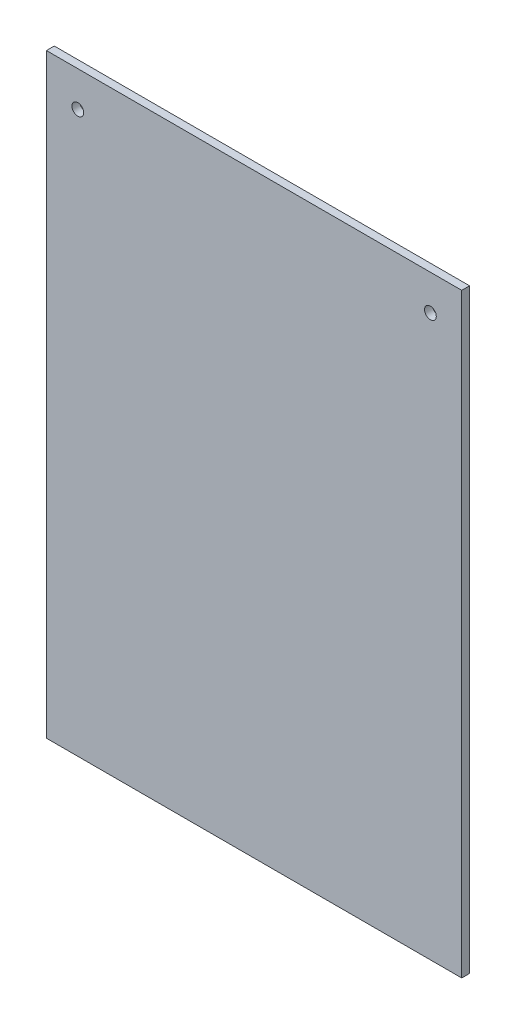
ISO-10303-21;
HEADER;
FILE_DESCRIPTION(('STEP AP214'),'2;1');
FILE_NAME('part.step','',(''),(''),'','','');
FILE_SCHEMA(('AUTOMOTIVE_DESIGN { 1 0 10303 214 1 1 1 1 }'));
ENDSEC;
DATA;
#1=APPLICATION_CONTEXT('core data for automotive mechanical design processes');
#2=APPLICATION_PROTOCOL_DEFINITION('international standard','automotive_design',2000,#1);
#3=PRODUCT_CONTEXT('',#1,'mechanical');
#4=PRODUCT('Part','Part','',(#3));
#5=PRODUCT_RELATED_PRODUCT_CATEGORY('part','',(#4));
#6=PRODUCT_DEFINITION_FORMATION('','',#4);
#7=PRODUCT_DEFINITION_CONTEXT('part definition',#1,'design');
#8=PRODUCT_DEFINITION('design','',#6,#7);
#9=PRODUCT_DEFINITION_SHAPE('','',#8);
#10=(LENGTH_UNIT() NAMED_UNIT(*) SI_UNIT(.MILLI.,.METRE.));
#11=(NAMED_UNIT(*) PLANE_ANGLE_UNIT() SI_UNIT($,.RADIAN.));
#12=(NAMED_UNIT(*) SI_UNIT($,.STERADIAN.) SOLID_ANGLE_UNIT());
#13=UNCERTAINTY_MEASURE_WITH_UNIT(LENGTH_MEASURE(1.E-05),#10,'distance_accuracy_value','');
#14=(GEOMETRIC_REPRESENTATION_CONTEXT(3) GLOBAL_UNCERTAINTY_ASSIGNED_CONTEXT((#13)) GLOBAL_UNIT_ASSIGNED_CONTEXT((#10,
#11,#12)) REPRESENTATION_CONTEXT('',''));
#15=CARTESIAN_POINT('',(0.,0.,0.));
#16=DIRECTION('',(0.,0.,1.));
#17=DIRECTION('',(1.,0.,0.));
#18=AXIS2_PLACEMENT_3D('',#15,#16,#17);
#19=CARTESIAN_POINT('',(0.,0.,0.));
#20=DIRECTION('',(0.,0.,1.));
#21=DIRECTION('',(1.,0.,0.));
#22=AXIS2_PLACEMENT_3D('',#19,#20,#21);
#23=PLANE('',#22);
#24=CARTESIAN_POINT('',(311.15,454.025,0.));
#25=DIRECTION('',(0.,0.,1.));
#26=DIRECTION('',(1.,0.,0.));
#27=AXIS2_PLACEMENT_3D('',#24,#25,#26);
#28=CIRCLE('',#27,4.7625);
#29=CARTESIAN_POINT('',(315.9125,454.025,0.));
#30=VERTEX_POINT('',#29);
#31=EDGE_CURVE('E82',#30,#30,#28,.T.);
#32=ORIENTED_EDGE('',*,*,#31,.T.);
#33=EDGE_LOOP('',(#32));
#34=FACE_BOUND('',#33,.T.);
#35=CARTESIAN_POINT('',(25.4,454.025,0.));
#36=DIRECTION('',(0.,0.,1.));
#37=DIRECTION('',(1.,0.,0.));
#38=AXIS2_PLACEMENT_3D('',#35,#36,#37);
#39=CIRCLE('',#38,4.7625);
#40=CARTESIAN_POINT('',(30.1625,454.025,0.));
#41=VERTEX_POINT('',#40);
#42=EDGE_CURVE('E19',#41,#41,#39,.T.);
#43=ORIENTED_EDGE('',*,*,#42,.T.);
#44=EDGE_LOOP('',(#43));
#45=FACE_BOUND('',#44,.T.);
#46=DIRECTION('',(1.,0.,0.));
#47=VECTOR('',#46,1.);
#48=CARTESIAN_POINT('',(336.55,482.6,0.));
#49=LINE('',#48,#47);
#50=CARTESIAN_POINT('',(336.55,482.6,0.));
#51=VERTEX_POINT('',#50);
#52=CARTESIAN_POINT('',(0.,482.6,0.));
#53=VERTEX_POINT('',#52);
#54=EDGE_CURVE('E54',#51,#53,#49,.F.);
#55=ORIENTED_EDGE('',*,*,#54,.F.);
#56=DIRECTION('',(0.,1.,0.));
#57=VECTOR('',#56,1.);
#58=CARTESIAN_POINT('',(336.55,0.,0.));
#59=LINE('',#58,#57);
#60=CARTESIAN_POINT('',(336.55,0.,0.));
#61=VERTEX_POINT('',#60);
#62=EDGE_CURVE('E59',#61,#51,#59,.T.);
#63=ORIENTED_EDGE('',*,*,#62,.F.);
#64=DIRECTION('',(1.,0.,0.));
#65=VECTOR('',#64,1.);
#66=CARTESIAN_POINT('',(0.,0.,0.));
#67=LINE('',#66,#65);
#68=CARTESIAN_POINT('',(0.,0.,0.));
#69=VERTEX_POINT('',#68);
#70=EDGE_CURVE('E89',#69,#61,#67,.T.);
#71=ORIENTED_EDGE('',*,*,#70,.F.);
#72=DIRECTION('',(0.,1.,0.));
#73=VECTOR('',#72,1.);
#74=CARTESIAN_POINT('',(0.,482.6,0.));
#75=LINE('',#74,#73);
#76=EDGE_CURVE('E69',#53,#69,#75,.F.);
#77=ORIENTED_EDGE('',*,*,#76,.F.);
#78=EDGE_LOOP('',(#55,#63,#71,#77));
#79=FACE_BOUND('',#78,.T.);
#80=ADVANCED_FACE('F16',(#34,#45,#79),#23,.F.);
#81=CARTESIAN_POINT('',(336.55,0.,0.));
#82=DIRECTION('',(1.,0.,0.));
#83=DIRECTION('',(0.,0.,-1.));
#84=AXIS2_PLACEMENT_3D('',#81,#82,#83);
#85=PLANE('',#84);
#86=DIRECTION('',(0.,0.,-1.));
#87=VECTOR('',#86,1.);
#88=CARTESIAN_POINT('',(336.55,0.,0.));
#89=LINE('',#88,#87);
#90=CARTESIAN_POINT('',(336.55,0.,6.35));
#91=VERTEX_POINT('',#90);
#92=EDGE_CURVE('E64',#61,#91,#89,.F.);
#93=ORIENTED_EDGE('',*,*,#92,.F.);
#94=ORIENTED_EDGE('',*,*,#62,.T.);
#95=DIRECTION('',(0.,0.,1.));
#96=VECTOR('',#95,1.);
#97=CARTESIAN_POINT('',(336.55,482.6,0.));
#98=LINE('',#97,#96);
#99=CARTESIAN_POINT('',(336.55,482.6,6.35));
#100=VERTEX_POINT('',#99);
#101=EDGE_CURVE('E61',#100,#51,#98,.F.);
#102=ORIENTED_EDGE('',*,*,#101,.F.);
#103=DIRECTION('',(0.,1.,0.));
#104=VECTOR('',#103,1.);
#105=CARTESIAN_POINT('',(336.55,0.,6.35));
#106=LINE('',#105,#104);
#107=EDGE_CURVE('E84',#91,#100,#106,.T.);
#108=ORIENTED_EDGE('',*,*,#107,.F.);
#109=EDGE_LOOP('',(#93,#94,#102,#108));
#110=FACE_BOUND('',#109,.T.);
#111=ADVANCED_FACE('F60',(#110),#85,.T.);
#112=CARTESIAN_POINT('',(336.55,482.6,0.));
#113=DIRECTION('',(0.,1.,0.));
#114=DIRECTION('',(0.,0.,1.));
#115=AXIS2_PLACEMENT_3D('',#112,#113,#114);
#116=PLANE('',#115);
#117=ORIENTED_EDGE('',*,*,#101,.T.);
#118=ORIENTED_EDGE('',*,*,#54,.T.);
#119=DIRECTION('',(0.,0.,1.));
#120=VECTOR('',#119,1.);
#121=CARTESIAN_POINT('',(0.,482.6,0.));
#122=LINE('',#121,#120);
#123=CARTESIAN_POINT('',(0.,482.6,6.35));
#124=VERTEX_POINT('',#123);
#125=EDGE_CURVE('E71',#124,#53,#122,.F.);
#126=ORIENTED_EDGE('',*,*,#125,.F.);
#127=DIRECTION('',(1.,0.,0.));
#128=VECTOR('',#127,1.);
#129=CARTESIAN_POINT('',(0.,482.6,6.35));
#130=LINE('',#129,#128);
#131=EDGE_CURVE('E75',#100,#124,#130,.F.);
#132=ORIENTED_EDGE('',*,*,#131,.F.);
#133=EDGE_LOOP('',(#117,#118,#126,#132));
#134=FACE_BOUND('',#133,.T.);
#135=ADVANCED_FACE('F73',(#134),#116,.T.);
#136=CARTESIAN_POINT('',(0.,482.6,0.));
#137=DIRECTION('',(-1.,0.,0.));
#138=DIRECTION('',(0.,0.,1.));
#139=AXIS2_PLACEMENT_3D('',#136,#137,#138);
#140=PLANE('',#139);
#141=ORIENTED_EDGE('',*,*,#125,.T.);
#142=ORIENTED_EDGE('',*,*,#76,.T.);
#143=DIRECTION('',(0.,0.,-1.));
#144=VECTOR('',#143,1.);
#145=CARTESIAN_POINT('',(0.,0.,0.));
#146=LINE('',#145,#144);
#147=CARTESIAN_POINT('',(0.,0.,6.35));
#148=VERTEX_POINT('',#147);
#149=EDGE_CURVE('E34',#148,#69,#146,.T.);
#150=ORIENTED_EDGE('',*,*,#149,.F.);
#151=DIRECTION('',(0.,1.,0.));
#152=VECTOR('',#151,1.);
#153=CARTESIAN_POINT('',(0.,0.,6.35));
#154=LINE('',#153,#152);
#155=EDGE_CURVE('E100',#124,#148,#154,.F.);
#156=ORIENTED_EDGE('',*,*,#155,.F.);
#157=EDGE_LOOP('',(#141,#142,#150,#156));
#158=FACE_BOUND('',#157,.T.);
#159=ADVANCED_FACE('F98',(#158),#140,.T.);
#160=CARTESIAN_POINT('',(0.,0.,0.));
#161=DIRECTION('',(0.,-1.,0.));
#162=DIRECTION('',(0.,0.,-1.));
#163=AXIS2_PLACEMENT_3D('',#160,#161,#162);
#164=PLANE('',#163);
#165=ORIENTED_EDGE('',*,*,#149,.T.);
#166=ORIENTED_EDGE('',*,*,#70,.T.);
#167=ORIENTED_EDGE('',*,*,#92,.T.);
#168=DIRECTION('',(1.,0.,0.));
#169=VECTOR('',#168,1.);
#170=CARTESIAN_POINT('',(0.,0.,6.35));
#171=LINE('',#170,#169);
#172=EDGE_CURVE('E81',#148,#91,#171,.T.);
#173=ORIENTED_EDGE('',*,*,#172,.F.);
#174=EDGE_LOOP('',(#165,#166,#167,#173));
#175=FACE_BOUND('',#174,.T.);
#176=ADVANCED_FACE('F106',(#175),#164,.T.);
#177=CARTESIAN_POINT('',(25.4,454.025,0.));
#178=DIRECTION('',(0.,0.,1.));
#179=DIRECTION('',(1.,0.,0.));
#180=AXIS2_PLACEMENT_3D('',#177,#178,#179);
#181=CYLINDRICAL_SURFACE('',#180,4.7625);
#182=CARTESIAN_POINT('',(25.4,454.025,6.35));
#183=DIRECTION('',(0.,0.,1.));
#184=DIRECTION('',(1.,0.,0.));
#185=AXIS2_PLACEMENT_3D('',#182,#183,#184);
#186=CIRCLE('',#185,4.7625);
#187=CARTESIAN_POINT('',(30.1625,454.025,6.35));
#188=VERTEX_POINT('',#187);
#189=EDGE_CURVE('E25',#188,#188,#186,.F.);
#190=ORIENTED_EDGE('',*,*,#189,.F.);
#191=EDGE_LOOP('',(#190));
#192=FACE_BOUND('',#191,.T.);
#193=ORIENTED_EDGE('',*,*,#42,.F.);
#194=EDGE_LOOP('',(#193));
#195=FACE_BOUND('',#194,.T.);
#196=ADVANCED_FACE('F108',(#192,#195),#181,.F.);
#197=CARTESIAN_POINT('',(311.15,454.025,0.));
#198=DIRECTION('',(0.,0.,1.));
#199=DIRECTION('',(1.,0.,0.));
#200=AXIS2_PLACEMENT_3D('',#197,#198,#199);
#201=CYLINDRICAL_SURFACE('',#200,4.7625);
#202=CARTESIAN_POINT('',(311.15,454.025,6.35));
#203=DIRECTION('',(0.,0.,1.));
#204=DIRECTION('',(1.,0.,0.));
#205=AXIS2_PLACEMENT_3D('',#202,#203,#204);
#206=CIRCLE('',#205,4.7625);
#207=CARTESIAN_POINT('',(315.9125,454.025,6.35));
#208=VERTEX_POINT('',#207);
#209=EDGE_CURVE('E11',#208,#208,#206,.F.);
#210=ORIENTED_EDGE('',*,*,#209,.F.);
#211=EDGE_LOOP('',(#210));
#212=FACE_BOUND('',#211,.T.);
#213=ORIENTED_EDGE('',*,*,#31,.F.);
#214=EDGE_LOOP('',(#213));
#215=FACE_BOUND('',#214,.T.);
#216=ADVANCED_FACE('F115',(#212,#215),#201,.F.);
#217=CARTESIAN_POINT('',(0.,0.,6.35));
#218=DIRECTION('',(0.,0.,1.));
#219=DIRECTION('',(1.,0.,0.));
#220=AXIS2_PLACEMENT_3D('',#217,#218,#219);
#221=PLANE('',#220);
#222=ORIENTED_EDGE('',*,*,#209,.T.);
#223=EDGE_LOOP('',(#222));
#224=FACE_BOUND('',#223,.T.);
#225=ORIENTED_EDGE('',*,*,#189,.T.);
#226=EDGE_LOOP('',(#225));
#227=FACE_BOUND('',#226,.T.);
#228=ORIENTED_EDGE('',*,*,#155,.T.);
#229=ORIENTED_EDGE('',*,*,#172,.T.);
#230=ORIENTED_EDGE('',*,*,#107,.T.);
#231=ORIENTED_EDGE('',*,*,#131,.T.);
#232=EDGE_LOOP('',(#228,#229,#230,#231));
#233=FACE_BOUND('',#232,.T.);
#234=ADVANCED_FACE('F104',(#224,#227,#233),#221,.T.);
#235=CLOSED_SHELL('',(#80,#111,#135,#159,#176,#196,#216,#234));
#236=MANIFOLD_SOLID_BREP('B1',#235);
#237=ADVANCED_BREP_SHAPE_REPRESENTATION('',(#18,#236),#14);
#238=SHAPE_DEFINITION_REPRESENTATION(#9,#237);
ENDSEC;
END-ISO-10303-21;
